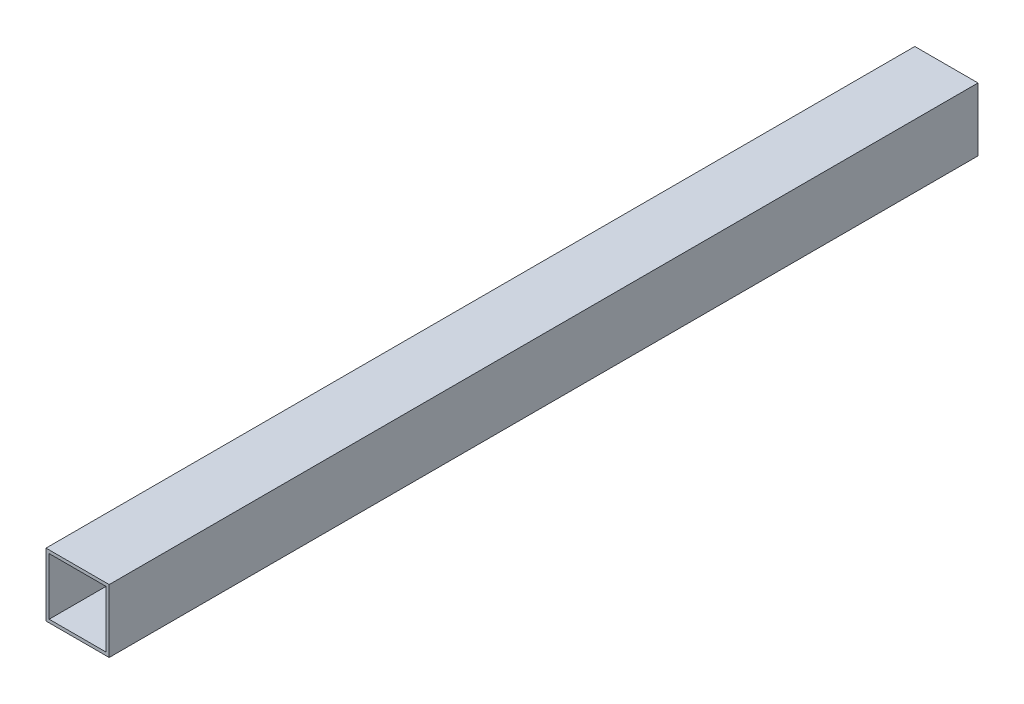
ISO-10303-21;
HEADER;
FILE_DESCRIPTION(('STEP AP214'),'2;1');
FILE_NAME('part.step','',(''),(''),'','','');
FILE_SCHEMA(('AUTOMOTIVE_DESIGN { 1 0 10303 214 1 1 1 1 }'));
ENDSEC;
DATA;
#1=APPLICATION_CONTEXT('core data for automotive mechanical design processes');
#2=APPLICATION_PROTOCOL_DEFINITION('international standard','automotive_design',2000,#1);
#3=PRODUCT_CONTEXT('',#1,'mechanical');
#4=PRODUCT('Part','Part','',(#3));
#5=PRODUCT_RELATED_PRODUCT_CATEGORY('part','',(#4));
#6=PRODUCT_DEFINITION_FORMATION('','',#4);
#7=PRODUCT_DEFINITION_CONTEXT('part definition',#1,'design');
#8=PRODUCT_DEFINITION('design','',#6,#7);
#9=PRODUCT_DEFINITION_SHAPE('','',#8);
#10=(LENGTH_UNIT() NAMED_UNIT(*) SI_UNIT(.MILLI.,.METRE.));
#11=(NAMED_UNIT(*) PLANE_ANGLE_UNIT() SI_UNIT($,.RADIAN.));
#12=(NAMED_UNIT(*) SI_UNIT($,.STERADIAN.) SOLID_ANGLE_UNIT());
#13=UNCERTAINTY_MEASURE_WITH_UNIT(LENGTH_MEASURE(1.E-05),#10,'distance_accuracy_value','');
#14=(GEOMETRIC_REPRESENTATION_CONTEXT(3) GLOBAL_UNCERTAINTY_ASSIGNED_CONTEXT((#13)) GLOBAL_UNIT_ASSIGNED_CONTEXT((#10,
#11,#12)) REPRESENTATION_CONTEXT('',''));
#15=CARTESIAN_POINT('',(0.,0.,0.));
#16=DIRECTION('',(0.,0.,1.));
#17=DIRECTION('',(1.,0.,0.));
#18=AXIS2_PLACEMENT_3D('',#15,#16,#17);
#19=CARTESIAN_POINT('',(0.,0.,0.));
#20=DIRECTION('',(0.,0.,-1.));
#21=DIRECTION('',(-1.,0.,0.));
#22=AXIS2_PLACEMENT_3D('',#19,#20,#21);
#23=PLANE('',#22);
#24=DIRECTION('',(0.,1.,0.));
#25=VECTOR('',#24,1.);
#26=CARTESIAN_POINT('',(-925.,1631.5,0.));
#27=LINE('',#26,#25);
#28=CARTESIAN_POINT('',(-925.,1591.5,0.));
#29=VERTEX_POINT('',#28);
#30=CARTESIAN_POINT('',(-925.,1631.5,0.));
#31=VERTEX_POINT('',#30);
#32=EDGE_CURVE('E131',#29,#31,#27,.T.);
#33=ORIENTED_EDGE('',*,*,#32,.F.);
#34=DIRECTION('',(1.,0.,0.));
#35=VECTOR('',#34,1.);
#36=CARTESIAN_POINT('',(-925.,1591.5,0.));
#37=LINE('',#36,#35);
#38=CARTESIAN_POINT('',(-965.,1591.5,0.));
#39=VERTEX_POINT('',#38);
#40=EDGE_CURVE('E101',#39,#29,#37,.T.);
#41=ORIENTED_EDGE('',*,*,#40,.F.);
#42=DIRECTION('',(0.,-1.,0.));
#43=VECTOR('',#42,1.);
#44=CARTESIAN_POINT('',(-965.,1631.5,0.));
#45=LINE('',#44,#43);
#46=CARTESIAN_POINT('',(-965.,1631.5,0.));
#47=VERTEX_POINT('',#46);
#48=EDGE_CURVE('E125',#47,#39,#45,.T.);
#49=ORIENTED_EDGE('',*,*,#48,.F.);
#50=DIRECTION('',(-1.,0.,0.));
#51=VECTOR('',#50,1.);
#52=CARTESIAN_POINT('',(-925.,1631.5,0.));
#53=LINE('',#52,#51);
#54=EDGE_CURVE('E121',#31,#47,#53,.T.);
#55=ORIENTED_EDGE('',*,*,#54,.F.);
#56=EDGE_LOOP('',(#33,#41,#49,#55));
#57=FACE_BOUND('',#56,.T.);
#58=DIRECTION('',(1.,0.,0.));
#59=VECTOR('',#58,1.);
#60=CARTESIAN_POINT('',(-927.,1593.5,0.));
#61=LINE('',#60,#59);
#62=CARTESIAN_POINT('',(-963.,1593.5,0.));
#63=VERTEX_POINT('',#62);
#64=CARTESIAN_POINT('',(-927.,1593.5,0.));
#65=VERTEX_POINT('',#64);
#66=EDGE_CURVE('E111',#63,#65,#61,.T.);
#67=ORIENTED_EDGE('',*,*,#66,.T.);
#68=DIRECTION('',(0.,1.,0.));
#69=VECTOR('',#68,1.);
#70=CARTESIAN_POINT('',(-927.,1629.5,0.));
#71=LINE('',#70,#69);
#72=CARTESIAN_POINT('',(-927.,1629.5,0.));
#73=VERTEX_POINT('',#72);
#74=EDGE_CURVE('E97',#65,#73,#71,.T.);
#75=ORIENTED_EDGE('',*,*,#74,.T.);
#76=DIRECTION('',(-1.,0.,0.));
#77=VECTOR('',#76,1.);
#78=CARTESIAN_POINT('',(-927.,1629.5,0.));
#79=LINE('',#78,#77);
#80=CARTESIAN_POINT('',(-963.,1629.5,0.));
#81=VERTEX_POINT('',#80);
#82=EDGE_CURVE('E104',#73,#81,#79,.T.);
#83=ORIENTED_EDGE('',*,*,#82,.T.);
#84=DIRECTION('',(0.,-1.,0.));
#85=VECTOR('',#84,1.);
#86=CARTESIAN_POINT('',(-963.,1629.5,0.));
#87=LINE('',#86,#85);
#88=EDGE_CURVE('E108',#81,#63,#87,.T.);
#89=ORIENTED_EDGE('',*,*,#88,.T.);
#90=EDGE_LOOP('',(#67,#75,#83,#89));
#91=FACE_BOUND('',#90,.T.);
#92=ADVANCED_FACE('F32',(#57,#91),#23,.T.);
#93=CARTESIAN_POINT('',(-925.,1631.5,606.568542494923));
#94=DIRECTION('',(-1.,0.,0.));
#95=DIRECTION('',(0.,0.,1.));
#96=AXIS2_PLACEMENT_3D('',#93,#94,#95);
#97=PLANE('',#96);
#98=DIRECTION('',(0.,0.,-1.));
#99=VECTOR('',#98,1.);
#100=CARTESIAN_POINT('',(-925.,1631.5,606.568542494923));
#101=LINE('',#100,#99);
#102=CARTESIAN_POINT('',(-925.,1631.5,550.));
#103=VERTEX_POINT('',#102);
#104=EDGE_CURVE('E119',#103,#31,#101,.T.);
#105=ORIENTED_EDGE('',*,*,#104,.F.);
#106=DIRECTION('',(0.,-1.,0.));
#107=VECTOR('',#106,1.);
#108=CARTESIAN_POINT('',(-925.,1631.5,550.));
#109=LINE('',#108,#107);
#110=CARTESIAN_POINT('',(-925.,1591.5,550.));
#111=VERTEX_POINT('',#110);
#112=EDGE_CURVE('E49',#103,#111,#109,.T.);
#113=ORIENTED_EDGE('',*,*,#112,.T.);
#114=DIRECTION('',(0.,0.,-1.));
#115=VECTOR('',#114,1.);
#116=CARTESIAN_POINT('',(-925.,1591.5,606.568542494923));
#117=LINE('',#116,#115);
#118=EDGE_CURVE('E130',#111,#29,#117,.T.);
#119=ORIENTED_EDGE('',*,*,#118,.T.);
#120=ORIENTED_EDGE('',*,*,#32,.T.);
#121=EDGE_LOOP('',(#105,#113,#119,#120));
#122=FACE_BOUND('',#121,.T.);
#123=ADVANCED_FACE('F173',(#122),#97,.F.);
#124=CARTESIAN_POINT('',(-925.,1631.5,606.568542494923));
#125=DIRECTION('',(0.,-1.,0.));
#126=DIRECTION('',(0.,0.,-1.));
#127=AXIS2_PLACEMENT_3D('',#124,#125,#126);
#128=PLANE('',#127);
#129=DIRECTION('',(0.,0.,-1.));
#130=VECTOR('',#129,1.);
#131=CARTESIAN_POINT('',(-965.,1631.5,606.568542494923));
#132=LINE('',#131,#130);
#133=CARTESIAN_POINT('',(-965.,1631.5,550.));
#134=VERTEX_POINT('',#133);
#135=EDGE_CURVE('E123',#134,#47,#132,.T.);
#136=ORIENTED_EDGE('',*,*,#135,.F.);
#137=DIRECTION('',(1.,0.,0.));
#138=VECTOR('',#137,1.);
#139=CARTESIAN_POINT('',(-925.,1631.5,550.));
#140=LINE('',#139,#138);
#141=EDGE_CURVE('E122',#134,#103,#140,.T.);
#142=ORIENTED_EDGE('',*,*,#141,.T.);
#143=ORIENTED_EDGE('',*,*,#104,.T.);
#144=ORIENTED_EDGE('',*,*,#54,.T.);
#145=EDGE_LOOP('',(#136,#142,#143,#144));
#146=FACE_BOUND('',#145,.T.);
#147=ADVANCED_FACE('F161',(#146),#128,.F.);
#148=CARTESIAN_POINT('',(-965.,1631.5,606.568542494923));
#149=DIRECTION('',(1.,0.,0.));
#150=DIRECTION('',(0.,0.,-1.));
#151=AXIS2_PLACEMENT_3D('',#148,#149,#150);
#152=PLANE('',#151);
#153=DIRECTION('',(0.,0.,-1.));
#154=VECTOR('',#153,1.);
#155=CARTESIAN_POINT('',(-965.,1591.5,606.568542494923));
#156=LINE('',#155,#154);
#157=CARTESIAN_POINT('',(-965.,1591.5,550.));
#158=VERTEX_POINT('',#157);
#159=EDGE_CURVE('E127',#158,#39,#156,.T.);
#160=ORIENTED_EDGE('',*,*,#159,.F.);
#161=DIRECTION('',(0.,1.,0.));
#162=VECTOR('',#161,1.);
#163=CARTESIAN_POINT('',(-965.,1631.5,550.));
#164=LINE('',#163,#162);
#165=EDGE_CURVE('E126',#158,#134,#164,.T.);
#166=ORIENTED_EDGE('',*,*,#165,.T.);
#167=ORIENTED_EDGE('',*,*,#135,.T.);
#168=ORIENTED_EDGE('',*,*,#48,.T.);
#169=EDGE_LOOP('',(#160,#166,#167,#168));
#170=FACE_BOUND('',#169,.T.);
#171=ADVANCED_FACE('F166',(#170),#152,.F.);
#172=CARTESIAN_POINT('',(-925.,1591.5,606.568542494923));
#173=DIRECTION('',(0.,1.,0.));
#174=DIRECTION('',(0.,0.,1.));
#175=AXIS2_PLACEMENT_3D('',#172,#173,#174);
#176=PLANE('',#175);
#177=ORIENTED_EDGE('',*,*,#118,.F.);
#178=DIRECTION('',(-1.,0.,0.));
#179=VECTOR('',#178,1.);
#180=CARTESIAN_POINT('',(-925.,1591.5,550.));
#181=LINE('',#180,#179);
#182=EDGE_CURVE('E129',#111,#158,#181,.T.);
#183=ORIENTED_EDGE('',*,*,#182,.T.);
#184=ORIENTED_EDGE('',*,*,#159,.T.);
#185=ORIENTED_EDGE('',*,*,#40,.T.);
#186=EDGE_LOOP('',(#177,#183,#184,#185));
#187=FACE_BOUND('',#186,.T.);
#188=ADVANCED_FACE('F171',(#187),#176,.F.);
#189=CARTESIAN_POINT('',(-927.,1629.5,606.568542494923));
#190=DIRECTION('',(-1.,0.,0.));
#191=DIRECTION('',(0.,0.,1.));
#192=AXIS2_PLACEMENT_3D('',#189,#190,#191);
#193=PLANE('',#192);
#194=DIRECTION('',(0.,-1.,0.));
#195=VECTOR('',#194,1.);
#196=CARTESIAN_POINT('',(-927.,1629.5,550.));
#197=LINE('',#196,#195);
#198=CARTESIAN_POINT('',(-927.,1629.5,550.));
#199=VERTEX_POINT('',#198);
#200=CARTESIAN_POINT('',(-927.,1593.5,550.));
#201=VERTEX_POINT('',#200);
#202=EDGE_CURVE('E100',#199,#201,#197,.T.);
#203=ORIENTED_EDGE('',*,*,#202,.F.);
#204=DIRECTION('',(0.,0.,-1.));
#205=VECTOR('',#204,1.);
#206=CARTESIAN_POINT('',(-927.,1629.5,606.568542494923));
#207=LINE('',#206,#205);
#208=EDGE_CURVE('E93',#199,#73,#207,.T.);
#209=ORIENTED_EDGE('',*,*,#208,.T.);
#210=ORIENTED_EDGE('',*,*,#74,.F.);
#211=DIRECTION('',(0.,0.,-1.));
#212=VECTOR('',#211,1.);
#213=CARTESIAN_POINT('',(-927.,1593.5,606.568542494923));
#214=LINE('',#213,#212);
#215=EDGE_CURVE('E136',#201,#65,#214,.T.);
#216=ORIENTED_EDGE('',*,*,#215,.F.);
#217=EDGE_LOOP('',(#203,#209,#210,#216));
#218=FACE_BOUND('',#217,.T.);
#219=ADVANCED_FACE('F94',(#218),#193,.T.);
#220=CARTESIAN_POINT('',(-927.,1629.5,606.568542494923));
#221=DIRECTION('',(0.,-1.,0.));
#222=DIRECTION('',(0.,0.,-1.));
#223=AXIS2_PLACEMENT_3D('',#220,#221,#222);
#224=PLANE('',#223);
#225=DIRECTION('',(1.,0.,0.));
#226=VECTOR('',#225,1.);
#227=CARTESIAN_POINT('',(-927.,1629.5,550.));
#228=LINE('',#227,#226);
#229=CARTESIAN_POINT('',(-963.,1629.5,550.));
#230=VERTEX_POINT('',#229);
#231=EDGE_CURVE('E11',#230,#199,#228,.T.);
#232=ORIENTED_EDGE('',*,*,#231,.F.);
#233=DIRECTION('',(0.,0.,-1.));
#234=VECTOR('',#233,1.);
#235=CARTESIAN_POINT('',(-963.,1629.5,606.568542494923));
#236=LINE('',#235,#234);
#237=EDGE_CURVE('E86',#230,#81,#236,.T.);
#238=ORIENTED_EDGE('',*,*,#237,.T.);
#239=ORIENTED_EDGE('',*,*,#82,.F.);
#240=ORIENTED_EDGE('',*,*,#208,.F.);
#241=EDGE_LOOP('',(#232,#238,#239,#240));
#242=FACE_BOUND('',#241,.T.);
#243=ADVANCED_FACE('F105',(#242),#224,.T.);
#244=CARTESIAN_POINT('',(-963.,1629.5,606.568542494923));
#245=DIRECTION('',(1.,0.,0.));
#246=DIRECTION('',(0.,0.,-1.));
#247=AXIS2_PLACEMENT_3D('',#244,#245,#246);
#248=PLANE('',#247);
#249=DIRECTION('',(0.,1.,0.));
#250=VECTOR('',#249,1.);
#251=CARTESIAN_POINT('',(-963.,1629.5,550.));
#252=LINE('',#251,#250);
#253=CARTESIAN_POINT('',(-963.,1593.5,550.));
#254=VERTEX_POINT('',#253);
#255=EDGE_CURVE('E36',#254,#230,#252,.T.);
#256=ORIENTED_EDGE('',*,*,#255,.F.);
#257=DIRECTION('',(0.,0.,-1.));
#258=VECTOR('',#257,1.);
#259=CARTESIAN_POINT('',(-963.,1593.5,606.568542494923));
#260=LINE('',#259,#258);
#261=EDGE_CURVE('E134',#254,#63,#260,.T.);
#262=ORIENTED_EDGE('',*,*,#261,.T.);
#263=ORIENTED_EDGE('',*,*,#88,.F.);
#264=ORIENTED_EDGE('',*,*,#237,.F.);
#265=EDGE_LOOP('',(#256,#262,#263,#264));
#266=FACE_BOUND('',#265,.T.);
#267=ADVANCED_FACE('F154',(#266),#248,.T.);
#268=CARTESIAN_POINT('',(-927.,1593.5,606.568542494923));
#269=DIRECTION('',(0.,1.,0.));
#270=DIRECTION('',(0.,0.,1.));
#271=AXIS2_PLACEMENT_3D('',#268,#269,#270);
#272=PLANE('',#271);
#273=DIRECTION('',(-1.,0.,0.));
#274=VECTOR('',#273,1.);
#275=CARTESIAN_POINT('',(-927.,1593.5,550.));
#276=LINE('',#275,#274);
#277=EDGE_CURVE('E116',#201,#254,#276,.T.);
#278=ORIENTED_EDGE('',*,*,#277,.F.);
#279=ORIENTED_EDGE('',*,*,#215,.T.);
#280=ORIENTED_EDGE('',*,*,#66,.F.);
#281=ORIENTED_EDGE('',*,*,#261,.F.);
#282=EDGE_LOOP('',(#278,#279,#280,#281));
#283=FACE_BOUND('',#282,.T.);
#284=ADVANCED_FACE('F151',(#283),#272,.T.);
#285=CARTESIAN_POINT('',(-925.,1631.5,550.));
#286=DIRECTION('',(0.,0.,-1.));
#287=DIRECTION('',(-1.,0.,0.));
#288=AXIS2_PLACEMENT_3D('',#285,#286,#287);
#289=PLANE('',#288);
#290=ORIENTED_EDGE('',*,*,#202,.T.);
#291=ORIENTED_EDGE('',*,*,#277,.T.);
#292=ORIENTED_EDGE('',*,*,#255,.T.);
#293=ORIENTED_EDGE('',*,*,#231,.T.);
#294=EDGE_LOOP('',(#290,#291,#292,#293));
#295=FACE_BOUND('',#294,.T.);
#296=ORIENTED_EDGE('',*,*,#141,.F.);
#297=ORIENTED_EDGE('',*,*,#165,.F.);
#298=ORIENTED_EDGE('',*,*,#182,.F.);
#299=ORIENTED_EDGE('',*,*,#112,.F.);
#300=EDGE_LOOP('',(#296,#297,#298,#299));
#301=FACE_BOUND('',#300,.T.);
#302=ADVANCED_FACE('F34',(#295,#301),#289,.F.);
#303=CLOSED_SHELL('',(#92,#123,#147,#171,#188,#219,#243,#267,#284,#302));
#304=MANIFOLD_SOLID_BREP('B2',#303);
#305=ADVANCED_BREP_SHAPE_REPRESENTATION('',(#18,#304),#14);
#306=SHAPE_DEFINITION_REPRESENTATION(#9,#305);
ENDSEC;
END-ISO-10303-21;
